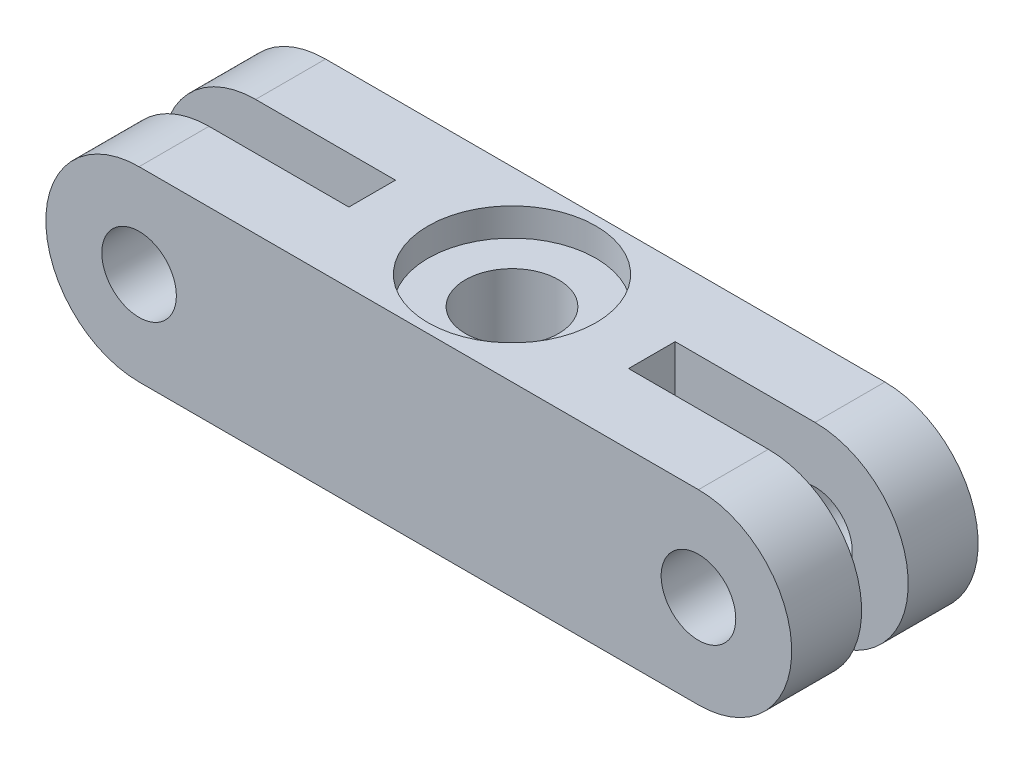
ISO-10303-21;
HEADER;
FILE_DESCRIPTION(('STEP AP214'),'2;1');
FILE_NAME('part.step','',(''),(''),'','','');
FILE_SCHEMA(('AUTOMOTIVE_DESIGN { 1 0 10303 214 1 1 1 1 }'));
ENDSEC;
DATA;
#1=APPLICATION_CONTEXT('core data for automotive mechanical design processes');
#2=APPLICATION_PROTOCOL_DEFINITION('international standard','automotive_design',2000,#1);
#3=PRODUCT_CONTEXT('',#1,'mechanical');
#4=PRODUCT('Part','Part','',(#3));
#5=PRODUCT_RELATED_PRODUCT_CATEGORY('part','',(#4));
#6=PRODUCT_DEFINITION_FORMATION('','',#4);
#7=PRODUCT_DEFINITION_CONTEXT('part definition',#1,'design');
#8=PRODUCT_DEFINITION('design','',#6,#7);
#9=PRODUCT_DEFINITION_SHAPE('','',#8);
#10=(LENGTH_UNIT() NAMED_UNIT(*) SI_UNIT(.MILLI.,.METRE.));
#11=(NAMED_UNIT(*) PLANE_ANGLE_UNIT() SI_UNIT($,.RADIAN.));
#12=(NAMED_UNIT(*) SI_UNIT($,.STERADIAN.) SOLID_ANGLE_UNIT());
#13=UNCERTAINTY_MEASURE_WITH_UNIT(LENGTH_MEASURE(1.E-05),#10,'distance_accuracy_value','');
#14=(GEOMETRIC_REPRESENTATION_CONTEXT(3) GLOBAL_UNCERTAINTY_ASSIGNED_CONTEXT((#13)) GLOBAL_UNIT_ASSIGNED_CONTEXT((#10,
#11,#12)) REPRESENTATION_CONTEXT('',''));
#15=CARTESIAN_POINT('',(0.,0.,0.));
#16=DIRECTION('',(0.,0.,1.));
#17=DIRECTION('',(1.,0.,0.));
#18=AXIS2_PLACEMENT_3D('',#15,#16,#17);
#19=CARTESIAN_POINT('',(0.,10.,10.));
#20=DIRECTION('',(0.,-1.,0.));
#21=DIRECTION('',(0.,0.,-1.));
#22=AXIS2_PLACEMENT_3D('',#19,#20,#21);
#23=PLANE('',#22);
#24=DIRECTION('',(0.,0.,-1.));
#25=VECTOR('',#24,1.);
#26=CARTESIAN_POINT('',(60.,10.,10.));
#27=LINE('',#26,#25);
#28=CARTESIAN_POINT('',(60.,10.,10.));
#29=VERTEX_POINT('',#28);
#30=CARTESIAN_POINT('',(60.,10.,2.5));
#31=VERTEX_POINT('',#30);
#32=EDGE_CURVE('E230',#29,#31,#27,.T.);
#33=ORIENTED_EDGE('',*,*,#32,.T.);
#34=DIRECTION('',(1.,0.,0.));
#35=VECTOR('',#34,1.);
#36=CARTESIAN_POINT('',(45.,10.,2.5));
#37=LINE('',#36,#35);
#38=CARTESIAN_POINT('',(45.,10.,2.5));
#39=VERTEX_POINT('',#38);
#40=EDGE_CURVE('E152',#39,#31,#37,.T.);
#41=ORIENTED_EDGE('',*,*,#40,.F.);
#42=DIRECTION('',(0.,0.,1.));
#43=VECTOR('',#42,1.);
#44=CARTESIAN_POINT('',(45.,10.,2.5));
#45=LINE('',#44,#43);
#46=CARTESIAN_POINT('',(45.,10.,-2.5));
#47=VERTEX_POINT('',#46);
#48=EDGE_CURVE('E136',#47,#39,#45,.T.);
#49=ORIENTED_EDGE('',*,*,#48,.F.);
#50=DIRECTION('',(-1.,0.,0.));
#51=VECTOR('',#50,1.);
#52=CARTESIAN_POINT('',(45.,10.,-2.5));
#53=LINE('',#52,#51);
#54=CARTESIAN_POINT('',(60.,10.,-2.5));
#55=VERTEX_POINT('',#54);
#56=EDGE_CURVE('E128',#55,#47,#53,.T.);
#57=ORIENTED_EDGE('',*,*,#56,.F.);
#58=CARTESIAN_POINT('',(60.,10.,-10.));
#59=VERTEX_POINT('',#58);
#60=EDGE_CURVE('E229',#55,#59,#27,.T.);
#61=ORIENTED_EDGE('',*,*,#60,.T.);
#62=DIRECTION('',(-1.,0.,0.));
#63=VECTOR('',#62,1.);
#64=CARTESIAN_POINT('',(0.,10.,-10.));
#65=LINE('',#64,#63);
#66=CARTESIAN_POINT('',(0.,10.,-10.));
#67=VERTEX_POINT('',#66);
#68=EDGE_CURVE('E209',#59,#67,#65,.T.);
#69=ORIENTED_EDGE('',*,*,#68,.T.);
#70=DIRECTION('',(0.,0.,-1.));
#71=VECTOR('',#70,1.);
#72=CARTESIAN_POINT('',(0.,10.,10.));
#73=LINE('',#72,#71);
#74=CARTESIAN_POINT('',(0.,10.,-2.5));
#75=VERTEX_POINT('',#74);
#76=EDGE_CURVE('E215',#75,#67,#73,.T.);
#77=ORIENTED_EDGE('',*,*,#76,.F.);
#78=DIRECTION('',(-1.,0.,0.));
#79=VECTOR('',#78,1.);
#80=CARTESIAN_POINT('',(15.,10.,-2.5));
#81=LINE('',#80,#79);
#82=CARTESIAN_POINT('',(15.,10.,-2.5));
#83=VERTEX_POINT('',#82);
#84=EDGE_CURVE('E165',#83,#75,#81,.T.);
#85=ORIENTED_EDGE('',*,*,#84,.F.);
#86=DIRECTION('',(0.,0.,-1.));
#87=VECTOR('',#86,1.);
#88=CARTESIAN_POINT('',(15.,10.,2.5));
#89=LINE('',#88,#87);
#90=CARTESIAN_POINT('',(15.,10.,2.5));
#91=VERTEX_POINT('',#90);
#92=EDGE_CURVE('E56',#91,#83,#89,.T.);
#93=ORIENTED_EDGE('',*,*,#92,.F.);
#94=DIRECTION('',(1.,0.,0.));
#95=VECTOR('',#94,1.);
#96=CARTESIAN_POINT('',(15.,10.,2.5));
#97=LINE('',#96,#95);
#98=CARTESIAN_POINT('',(0.,10.,2.5));
#99=VERTEX_POINT('',#98);
#100=EDGE_CURVE('E169',#99,#91,#97,.T.);
#101=ORIENTED_EDGE('',*,*,#100,.F.);
#102=CARTESIAN_POINT('',(0.,10.,10.));
#103=VERTEX_POINT('',#102);
#104=EDGE_CURVE('E226',#103,#99,#73,.T.);
#105=ORIENTED_EDGE('',*,*,#104,.F.);
#106=DIRECTION('',(-1.,0.,0.));
#107=VECTOR('',#106,1.);
#108=CARTESIAN_POINT('',(0.,10.,10.));
#109=LINE('',#108,#107);
#110=EDGE_CURVE('E213',#29,#103,#109,.T.);
#111=ORIENTED_EDGE('',*,*,#110,.F.);
#112=EDGE_LOOP('',(#33,#41,#49,#57,#61,#69,#77,#85,#93,#101,#105,#111));
#113=FACE_BOUND('',#112,.T.);
#114=CARTESIAN_POINT('',(30.,10.,0.));
#115=DIRECTION('',(0.,1.,0.));
#116=DIRECTION('',(0.,0.,1.));
#117=AXIS2_PLACEMENT_3D('',#114,#115,#116);
#118=CIRCLE('',#117,9.00000000000001);
#119=CARTESIAN_POINT('',(30.,10.,9.00000000000001));
#120=VERTEX_POINT('',#119);
#121=EDGE_CURVE('E358',#120,#120,#118,.T.);
#122=ORIENTED_EDGE('',*,*,#121,.F.);
#123=EDGE_LOOP('',(#122));
#124=FACE_BOUND('',#123,.T.);
#125=ADVANCED_FACE('F39',(#113,#124),#23,.F.);
#126=CARTESIAN_POINT('',(0.,0.,10.));
#127=DIRECTION('',(0.,0.,-1.));
#128=DIRECTION('',(-1.,0.,0.));
#129=AXIS2_PLACEMENT_3D('',#126,#127,#128);
#130=CYLINDRICAL_SURFACE('',#129,10.);
#131=ORIENTED_EDGE('',*,*,#104,.T.);
#132=CARTESIAN_POINT('',(0.,0.,2.5));
#133=DIRECTION('',(0.,0.,1.));
#134=DIRECTION('',(1.,0.,0.));
#135=AXIS2_PLACEMENT_3D('',#132,#133,#134);
#136=CIRCLE('',#135,10.);
#137=CARTESIAN_POINT('',(0.,-10.,2.5));
#138=VERTEX_POINT('',#137);
#139=EDGE_CURVE('E190',#99,#138,#136,.T.);
#140=ORIENTED_EDGE('',*,*,#139,.T.);
#141=DIRECTION('',(0.,0.,-1.));
#142=VECTOR('',#141,1.);
#143=CARTESIAN_POINT('',(0.,-10.,10.));
#144=LINE('',#143,#142);
#145=CARTESIAN_POINT('',(0.,-10.,10.));
#146=VERTEX_POINT('',#145);
#147=EDGE_CURVE('E11',#146,#138,#144,.T.);
#148=ORIENTED_EDGE('',*,*,#147,.F.);
#149=CARTESIAN_POINT('',(0.,0.,10.));
#150=DIRECTION('',(0.,0.,1.));
#151=DIRECTION('',(1.,0.,0.));
#152=AXIS2_PLACEMENT_3D('',#149,#150,#151);
#153=CIRCLE('',#152,10.);
#154=EDGE_CURVE('E205',#103,#146,#153,.T.);
#155=ORIENTED_EDGE('',*,*,#154,.F.);
#156=EDGE_LOOP('',(#131,#140,#148,#155));
#157=FACE_BOUND('',#156,.T.);
#158=ADVANCED_FACE('F277',(#157),#130,.T.);
#159=CARTESIAN_POINT('',(60.,0.,10.));
#160=DIRECTION('',(0.,0.,-1.));
#161=DIRECTION('',(-1.,0.,0.));
#162=AXIS2_PLACEMENT_3D('',#159,#160,#161);
#163=CYLINDRICAL_SURFACE('',#162,10.);
#164=CARTESIAN_POINT('',(60.,0.,2.5));
#165=DIRECTION('',(0.,0.,1.));
#166=DIRECTION('',(1.,0.,0.));
#167=AXIS2_PLACEMENT_3D('',#164,#165,#166);
#168=CIRCLE('',#167,10.);
#169=CARTESIAN_POINT('',(60.,-10.,2.5));
#170=VERTEX_POINT('',#169);
#171=EDGE_CURVE('E185',#170,#31,#168,.T.);
#172=ORIENTED_EDGE('',*,*,#171,.T.);
#173=ORIENTED_EDGE('',*,*,#32,.F.);
#174=CARTESIAN_POINT('',(60.,0.,10.));
#175=DIRECTION('',(0.,0.,1.));
#176=DIRECTION('',(1.,0.,0.));
#177=AXIS2_PLACEMENT_3D('',#174,#175,#176);
#178=CIRCLE('',#177,10.);
#179=CARTESIAN_POINT('',(60.,-10.,10.));
#180=VERTEX_POINT('',#179);
#181=EDGE_CURVE('E211',#180,#29,#178,.T.);
#182=ORIENTED_EDGE('',*,*,#181,.F.);
#183=DIRECTION('',(0.,0.,-1.));
#184=VECTOR('',#183,1.);
#185=CARTESIAN_POINT('',(60.,-10.,10.));
#186=LINE('',#185,#184);
#187=EDGE_CURVE('E233',#180,#170,#186,.T.);
#188=ORIENTED_EDGE('',*,*,#187,.T.);
#189=EDGE_LOOP('',(#172,#173,#182,#188));
#190=FACE_BOUND('',#189,.T.);
#191=ADVANCED_FACE('F284',(#190),#163,.T.);
#192=CARTESIAN_POINT('',(0.,0.,10.));
#193=DIRECTION('',(0.,0.,-1.));
#194=DIRECTION('',(-1.,0.,0.));
#195=AXIS2_PLACEMENT_3D('',#192,#193,#194);
#196=CYLINDRICAL_SURFACE('',#195,4.);
#197=CARTESIAN_POINT('',(0.,0.,2.5));
#198=DIRECTION('',(0.,0.,1.));
#199=DIRECTION('',(1.,0.,0.));
#200=AXIS2_PLACEMENT_3D('',#197,#198,#199);
#201=CIRCLE('',#200,4.);
#202=CARTESIAN_POINT('',(4.,0.,2.5));
#203=VERTEX_POINT('',#202);
#204=EDGE_CURVE('E43',#203,#203,#201,.T.);
#205=ORIENTED_EDGE('',*,*,#204,.F.);
#206=EDGE_LOOP('',(#205));
#207=FACE_BOUND('',#206,.T.);
#208=CARTESIAN_POINT('',(0.,0.,10.));
#209=DIRECTION('',(0.,0.,1.));
#210=DIRECTION('',(1.,0.,0.));
#211=AXIS2_PLACEMENT_3D('',#208,#209,#210);
#212=CIRCLE('',#211,4.);
#213=CARTESIAN_POINT('',(4.,0.,10.));
#214=VERTEX_POINT('',#213);
#215=EDGE_CURVE('E199',#214,#214,#212,.T.);
#216=ORIENTED_EDGE('',*,*,#215,.T.);
#217=EDGE_LOOP('',(#216));
#218=FACE_BOUND('',#217,.T.);
#219=ADVANCED_FACE('F251',(#207,#218),#196,.F.);
#220=CARTESIAN_POINT('',(60.,0.,10.));
#221=DIRECTION('',(0.,0.,-1.));
#222=DIRECTION('',(-1.,0.,0.));
#223=AXIS2_PLACEMENT_3D('',#220,#221,#222);
#224=CYLINDRICAL_SURFACE('',#223,4.00000000000001);
#225=CARTESIAN_POINT('',(60.,0.,2.5));
#226=DIRECTION('',(0.,0.,1.));
#227=DIRECTION('',(1.,0.,0.));
#228=AXIS2_PLACEMENT_3D('',#225,#226,#227);
#229=CIRCLE('',#228,4.00000000000001);
#230=CARTESIAN_POINT('',(64.,0.,2.5));
#231=VERTEX_POINT('',#230);
#232=EDGE_CURVE('E184',#231,#231,#229,.T.);
#233=ORIENTED_EDGE('',*,*,#232,.F.);
#234=EDGE_LOOP('',(#233));
#235=FACE_BOUND('',#234,.T.);
#236=CARTESIAN_POINT('',(60.,0.,10.));
#237=DIRECTION('',(0.,0.,1.));
#238=DIRECTION('',(1.,0.,0.));
#239=AXIS2_PLACEMENT_3D('',#236,#237,#238);
#240=CIRCLE('',#239,4.00000000000001);
#241=CARTESIAN_POINT('',(64.,0.,10.));
#242=VERTEX_POINT('',#241);
#243=EDGE_CURVE('E193',#242,#242,#240,.T.);
#244=ORIENTED_EDGE('',*,*,#243,.T.);
#245=EDGE_LOOP('',(#244));
#246=FACE_BOUND('',#245,.T.);
#247=ADVANCED_FACE('F266',(#235,#246),#224,.F.);
#248=CARTESIAN_POINT('',(0.,0.,10.));
#249=DIRECTION('',(0.,0.,1.));
#250=DIRECTION('',(1.,0.,0.));
#251=AXIS2_PLACEMENT_3D('',#248,#249,#250);
#252=PLANE('',#251);
#253=ORIENTED_EDGE('',*,*,#215,.F.);
#254=EDGE_LOOP('',(#253));
#255=FACE_BOUND('',#254,.T.);
#256=ORIENTED_EDGE('',*,*,#154,.T.);
#257=DIRECTION('',(1.,0.,0.));
#258=VECTOR('',#257,1.);
#259=CARTESIAN_POINT('',(0.,-10.,10.));
#260=LINE('',#259,#258);
#261=EDGE_CURVE('E208',#146,#180,#260,.T.);
#262=ORIENTED_EDGE('',*,*,#261,.T.);
#263=ORIENTED_EDGE('',*,*,#181,.T.);
#264=ORIENTED_EDGE('',*,*,#110,.T.);
#265=EDGE_LOOP('',(#256,#262,#263,#264));
#266=FACE_BOUND('',#265,.T.);
#267=ORIENTED_EDGE('',*,*,#243,.F.);
#268=EDGE_LOOP('',(#267));
#269=FACE_BOUND('',#268,.T.);
#270=ADVANCED_FACE('F257',(#255,#266,#269),#252,.T.);
#271=CARTESIAN_POINT('',(0.,0.,-10.));
#272=DIRECTION('',(0.,0.,1.));
#273=DIRECTION('',(1.,0.,0.));
#274=AXIS2_PLACEMENT_3D('',#271,#272,#273);
#275=PLANE('',#274);
#276=CARTESIAN_POINT('',(0.,0.,-10.));
#277=DIRECTION('',(0.,0.,1.));
#278=DIRECTION('',(1.,0.,0.));
#279=AXIS2_PLACEMENT_3D('',#276,#277,#278);
#280=CIRCLE('',#279,10.);
#281=CARTESIAN_POINT('',(0.,-10.,-10.));
#282=VERTEX_POINT('',#281);
#283=EDGE_CURVE('E202',#67,#282,#280,.T.);
#284=ORIENTED_EDGE('',*,*,#283,.F.);
#285=ORIENTED_EDGE('',*,*,#68,.F.);
#286=CARTESIAN_POINT('',(60.,0.,-10.));
#287=DIRECTION('',(0.,0.,1.));
#288=DIRECTION('',(1.,0.,0.));
#289=AXIS2_PLACEMENT_3D('',#286,#287,#288);
#290=CIRCLE('',#289,10.);
#291=CARTESIAN_POINT('',(60.,-10.,-10.));
#292=VERTEX_POINT('',#291);
#293=EDGE_CURVE('E221',#292,#59,#290,.T.);
#294=ORIENTED_EDGE('',*,*,#293,.F.);
#295=DIRECTION('',(1.,0.,0.));
#296=VECTOR('',#295,1.);
#297=CARTESIAN_POINT('',(0.,-10.,-10.));
#298=LINE('',#297,#296);
#299=EDGE_CURVE('E218',#282,#292,#298,.T.);
#300=ORIENTED_EDGE('',*,*,#299,.F.);
#301=EDGE_LOOP('',(#284,#285,#294,#300));
#302=FACE_BOUND('',#301,.T.);
#303=CARTESIAN_POINT('',(0.,0.,-10.));
#304=DIRECTION('',(0.,0.,1.));
#305=DIRECTION('',(1.,0.,0.));
#306=AXIS2_PLACEMENT_3D('',#303,#304,#305);
#307=CIRCLE('',#306,4.);
#308=CARTESIAN_POINT('',(4.,0.,-10.));
#309=VERTEX_POINT('',#308);
#310=EDGE_CURVE('E196',#309,#309,#307,.T.);
#311=ORIENTED_EDGE('',*,*,#310,.T.);
#312=EDGE_LOOP('',(#311));
#313=FACE_BOUND('',#312,.T.);
#314=CARTESIAN_POINT('',(60.,0.,-10.));
#315=DIRECTION('',(0.,0.,1.));
#316=DIRECTION('',(1.,0.,0.));
#317=AXIS2_PLACEMENT_3D('',#314,#315,#316);
#318=CIRCLE('',#317,4.00000000000001);
#319=CARTESIAN_POINT('',(64.,0.,-10.));
#320=VERTEX_POINT('',#319);
#321=EDGE_CURVE('E192',#320,#320,#318,.T.);
#322=ORIENTED_EDGE('',*,*,#321,.T.);
#323=EDGE_LOOP('',(#322));
#324=FACE_BOUND('',#323,.T.);
#325=ADVANCED_FACE('F254',(#302,#313,#324),#275,.F.);
#326=CARTESIAN_POINT('',(0.,0.,-2.5));
#327=DIRECTION('',(0.,0.,-1.));
#328=DIRECTION('',(-1.,0.,0.));
#329=AXIS2_PLACEMENT_3D('',#326,#327,#328);
#330=CIRCLE('',#329,10.);
#331=CARTESIAN_POINT('',(0.,-10.,-2.5));
#332=VERTEX_POINT('',#331);
#333=EDGE_CURVE('E188',#332,#75,#330,.T.);
#334=ORIENTED_EDGE('',*,*,#333,.T.);
#335=ORIENTED_EDGE('',*,*,#76,.T.);
#336=ORIENTED_EDGE('',*,*,#283,.T.);
#337=EDGE_CURVE('E48',#332,#282,#144,.T.);
#338=ORIENTED_EDGE('',*,*,#337,.F.);
#339=EDGE_LOOP('',(#334,#335,#336,#338));
#340=FACE_BOUND('',#339,.T.);
#341=ADVANCED_FACE('F41',(#340),#130,.T.);
#342=CARTESIAN_POINT('',(0.,-10.,10.));
#343=DIRECTION('',(0.,1.,0.));
#344=DIRECTION('',(0.,0.,1.));
#345=AXIS2_PLACEMENT_3D('',#342,#343,#344);
#346=PLANE('',#345);
#347=CARTESIAN_POINT('',(30.,-10.,0.));
#348=DIRECTION('',(0.,1.,0.));
#349=DIRECTION('',(0.,0.,1.));
#350=AXIS2_PLACEMENT_3D('',#347,#348,#349);
#351=CIRCLE('',#350,5.00000000000001);
#352=CARTESIAN_POINT('',(30.,-10.,5.00000000000001));
#353=VERTEX_POINT('',#352);
#354=EDGE_CURVE('E166',#353,#353,#351,.T.);
#355=ORIENTED_EDGE('',*,*,#354,.T.);
#356=EDGE_LOOP('',(#355));
#357=FACE_BOUND('',#356,.T.);
#358=DIRECTION('',(0.,0.,1.));
#359=VECTOR('',#358,1.);
#360=CARTESIAN_POINT('',(45.,-10.,2.5));
#361=LINE('',#360,#359);
#362=CARTESIAN_POINT('',(45.,-10.,-2.5));
#363=VERTEX_POINT('',#362);
#364=CARTESIAN_POINT('',(45.,-10.,2.5));
#365=VERTEX_POINT('',#364);
#366=EDGE_CURVE('E144',#363,#365,#361,.T.);
#367=ORIENTED_EDGE('',*,*,#366,.T.);
#368=DIRECTION('',(1.,0.,0.));
#369=VECTOR('',#368,1.);
#370=CARTESIAN_POINT('',(45.,-10.,2.5));
#371=LINE('',#370,#369);
#372=EDGE_CURVE('E147',#365,#170,#371,.T.);
#373=ORIENTED_EDGE('',*,*,#372,.T.);
#374=ORIENTED_EDGE('',*,*,#187,.F.);
#375=ORIENTED_EDGE('',*,*,#261,.F.);
#376=ORIENTED_EDGE('',*,*,#147,.T.);
#377=DIRECTION('',(1.,0.,0.));
#378=VECTOR('',#377,1.);
#379=CARTESIAN_POINT('',(15.,-10.,2.5));
#380=LINE('',#379,#378);
#381=CARTESIAN_POINT('',(15.,-10.,2.5));
#382=VERTEX_POINT('',#381);
#383=EDGE_CURVE('E177',#138,#382,#380,.T.);
#384=ORIENTED_EDGE('',*,*,#383,.T.);
#385=DIRECTION('',(0.,0.,-1.));
#386=VECTOR('',#385,1.);
#387=CARTESIAN_POINT('',(15.,-10.,2.5));
#388=LINE('',#387,#386);
#389=CARTESIAN_POINT('',(15.,-10.,-2.5));
#390=VERTEX_POINT('',#389);
#391=EDGE_CURVE('E171',#382,#390,#388,.T.);
#392=ORIENTED_EDGE('',*,*,#391,.T.);
#393=DIRECTION('',(-1.,0.,0.));
#394=VECTOR('',#393,1.);
#395=CARTESIAN_POINT('',(15.,-10.,-2.5));
#396=LINE('',#395,#394);
#397=EDGE_CURVE('E174',#390,#332,#396,.T.);
#398=ORIENTED_EDGE('',*,*,#397,.T.);
#399=ORIENTED_EDGE('',*,*,#337,.T.);
#400=ORIENTED_EDGE('',*,*,#299,.T.);
#401=CARTESIAN_POINT('',(60.,-10.,-2.5));
#402=VERTEX_POINT('',#401);
#403=EDGE_CURVE('E232',#402,#292,#186,.T.);
#404=ORIENTED_EDGE('',*,*,#403,.F.);
#405=DIRECTION('',(-1.,0.,0.));
#406=VECTOR('',#405,1.);
#407=CARTESIAN_POINT('',(45.,-10.,-2.5));
#408=LINE('',#407,#406);
#409=EDGE_CURVE('E154',#402,#363,#408,.T.);
#410=ORIENTED_EDGE('',*,*,#409,.T.);
#411=EDGE_LOOP('',(#367,#373,#374,#375,#376,#384,#392,#398,#399,#400,#404,#410));
#412=FACE_BOUND('',#411,.T.);
#413=ADVANCED_FACE('F289',(#357,#412),#346,.F.);
#414=ORIENTED_EDGE('',*,*,#60,.F.);
#415=CARTESIAN_POINT('',(60.,0.,-2.5));
#416=DIRECTION('',(0.,0.,-1.));
#417=DIRECTION('',(-1.,0.,0.));
#418=AXIS2_PLACEMENT_3D('',#415,#416,#417);
#419=CIRCLE('',#418,10.);
#420=EDGE_CURVE('E64',#55,#402,#419,.T.);
#421=ORIENTED_EDGE('',*,*,#420,.T.);
#422=ORIENTED_EDGE('',*,*,#403,.T.);
#423=ORIENTED_EDGE('',*,*,#293,.T.);
#424=EDGE_LOOP('',(#414,#421,#422,#423));
#425=FACE_BOUND('',#424,.T.);
#426=ADVANCED_FACE('F249',(#425),#163,.T.);
#427=CARTESIAN_POINT('',(0.,0.,-2.5));
#428=DIRECTION('',(0.,0.,-1.));
#429=DIRECTION('',(-1.,0.,0.));
#430=AXIS2_PLACEMENT_3D('',#427,#428,#429);
#431=CIRCLE('',#430,4.);
#432=CARTESIAN_POINT('',(-4.,0.,-2.5));
#433=VERTEX_POINT('',#432);
#434=EDGE_CURVE('E187',#433,#433,#431,.T.);
#435=ORIENTED_EDGE('',*,*,#434,.F.);
#436=EDGE_LOOP('',(#435));
#437=FACE_BOUND('',#436,.T.);
#438=ORIENTED_EDGE('',*,*,#310,.F.);
#439=EDGE_LOOP('',(#438));
#440=FACE_BOUND('',#439,.T.);
#441=ADVANCED_FACE('F245',(#437,#440),#196,.F.);
#442=CARTESIAN_POINT('',(60.,0.,-2.5));
#443=DIRECTION('',(0.,0.,-1.));
#444=DIRECTION('',(-1.,0.,0.));
#445=AXIS2_PLACEMENT_3D('',#442,#443,#444);
#446=CIRCLE('',#445,4.00000000000001);
#447=CARTESIAN_POINT('',(56.,0.,-2.5));
#448=VERTEX_POINT('',#447);
#449=EDGE_CURVE('E162',#448,#448,#446,.T.);
#450=ORIENTED_EDGE('',*,*,#449,.F.);
#451=EDGE_LOOP('',(#450));
#452=FACE_BOUND('',#451,.T.);
#453=ORIENTED_EDGE('',*,*,#321,.F.);
#454=EDGE_LOOP('',(#453));
#455=FACE_BOUND('',#454,.T.);
#456=ADVANCED_FACE('F248',(#452,#455),#224,.F.);
#457=CARTESIAN_POINT('',(45.,-10.,2.5));
#458=DIRECTION('',(0.,0.,1.));
#459=DIRECTION('',(1.,0.,0.));
#460=AXIS2_PLACEMENT_3D('',#457,#458,#459);
#461=PLANE('',#460);
#462=ORIENTED_EDGE('',*,*,#232,.T.);
#463=EDGE_LOOP('',(#462));
#464=FACE_BOUND('',#463,.T.);
#465=ORIENTED_EDGE('',*,*,#171,.F.);
#466=ORIENTED_EDGE('',*,*,#372,.F.);
#467=DIRECTION('',(0.,1.,0.));
#468=VECTOR('',#467,1.);
#469=CARTESIAN_POINT('',(45.,-10.,2.5));
#470=LINE('',#469,#468);
#471=EDGE_CURVE('E146',#365,#39,#470,.T.);
#472=ORIENTED_EDGE('',*,*,#471,.T.);
#473=ORIENTED_EDGE('',*,*,#40,.T.);
#474=EDGE_LOOP('',(#465,#466,#472,#473));
#475=FACE_BOUND('',#474,.T.);
#476=ADVANCED_FACE('F263',(#464,#475),#461,.F.);
#477=CARTESIAN_POINT('',(45.,-10.,-2.5));
#478=DIRECTION('',(0.,0.,-1.));
#479=DIRECTION('',(-1.,0.,0.));
#480=AXIS2_PLACEMENT_3D('',#477,#478,#479);
#481=PLANE('',#480);
#482=ORIENTED_EDGE('',*,*,#449,.T.);
#483=EDGE_LOOP('',(#482));
#484=FACE_BOUND('',#483,.T.);
#485=ORIENTED_EDGE('',*,*,#56,.T.);
#486=DIRECTION('',(0.,1.,0.));
#487=VECTOR('',#486,1.);
#488=CARTESIAN_POINT('',(45.,-10.,-2.5));
#489=LINE('',#488,#487);
#490=EDGE_CURVE('E131',#363,#47,#489,.T.);
#491=ORIENTED_EDGE('',*,*,#490,.F.);
#492=ORIENTED_EDGE('',*,*,#409,.F.);
#493=ORIENTED_EDGE('',*,*,#420,.F.);
#494=EDGE_LOOP('',(#485,#491,#492,#493));
#495=FACE_BOUND('',#494,.T.);
#496=ADVANCED_FACE('F130',(#484,#495),#481,.F.);
#497=CARTESIAN_POINT('',(45.,-10.,2.5));
#498=DIRECTION('',(-1.,0.,0.));
#499=DIRECTION('',(0.,0.,1.));
#500=AXIS2_PLACEMENT_3D('',#497,#498,#499);
#501=PLANE('',#500);
#502=ORIENTED_EDGE('',*,*,#471,.F.);
#503=ORIENTED_EDGE('',*,*,#366,.F.);
#504=ORIENTED_EDGE('',*,*,#490,.T.);
#505=ORIENTED_EDGE('',*,*,#48,.T.);
#506=EDGE_LOOP('',(#502,#503,#504,#505));
#507=FACE_BOUND('',#506,.T.);
#508=ADVANCED_FACE('F141',(#507),#501,.F.);
#509=CARTESIAN_POINT('',(15.,-10.,2.5));
#510=DIRECTION('',(0.,0.,1.));
#511=DIRECTION('',(1.,0.,0.));
#512=AXIS2_PLACEMENT_3D('',#509,#510,#511);
#513=PLANE('',#512);
#514=ORIENTED_EDGE('',*,*,#204,.T.);
#515=EDGE_LOOP('',(#514));
#516=FACE_BOUND('',#515,.T.);
#517=ORIENTED_EDGE('',*,*,#100,.T.);
#518=DIRECTION('',(0.,1.,0.));
#519=VECTOR('',#518,1.);
#520=CARTESIAN_POINT('',(15.,-10.,2.5));
#521=LINE('',#520,#519);
#522=EDGE_CURVE('E137',#382,#91,#521,.T.);
#523=ORIENTED_EDGE('',*,*,#522,.F.);
#524=ORIENTED_EDGE('',*,*,#383,.F.);
#525=ORIENTED_EDGE('',*,*,#139,.F.);
#526=EDGE_LOOP('',(#517,#523,#524,#525));
#527=FACE_BOUND('',#526,.T.);
#528=ADVANCED_FACE('F325',(#516,#527),#513,.F.);
#529=CARTESIAN_POINT('',(15.,-10.,-2.5));
#530=DIRECTION('',(0.,0.,-1.));
#531=DIRECTION('',(-1.,0.,0.));
#532=AXIS2_PLACEMENT_3D('',#529,#530,#531);
#533=PLANE('',#532);
#534=ORIENTED_EDGE('',*,*,#434,.T.);
#535=EDGE_LOOP('',(#534));
#536=FACE_BOUND('',#535,.T.);
#537=ORIENTED_EDGE('',*,*,#333,.F.);
#538=ORIENTED_EDGE('',*,*,#397,.F.);
#539=DIRECTION('',(0.,1.,0.));
#540=VECTOR('',#539,1.);
#541=CARTESIAN_POINT('',(15.,-10.,-2.5));
#542=LINE('',#541,#540);
#543=EDGE_CURVE('E180',#390,#83,#542,.T.);
#544=ORIENTED_EDGE('',*,*,#543,.T.);
#545=ORIENTED_EDGE('',*,*,#84,.T.);
#546=EDGE_LOOP('',(#537,#538,#544,#545));
#547=FACE_BOUND('',#546,.T.);
#548=ADVANCED_FACE('F242',(#536,#547),#533,.F.);
#549=CARTESIAN_POINT('',(15.,-10.,2.5));
#550=DIRECTION('',(1.,0.,0.));
#551=DIRECTION('',(0.,0.,-1.));
#552=AXIS2_PLACEMENT_3D('',#549,#550,#551);
#553=PLANE('',#552);
#554=ORIENTED_EDGE('',*,*,#543,.F.);
#555=ORIENTED_EDGE('',*,*,#391,.F.);
#556=ORIENTED_EDGE('',*,*,#522,.T.);
#557=ORIENTED_EDGE('',*,*,#92,.T.);
#558=EDGE_LOOP('',(#554,#555,#556,#557));
#559=FACE_BOUND('',#558,.T.);
#560=ADVANCED_FACE('F326',(#559),#553,.F.);
#561=CARTESIAN_POINT('',(30.,10.,0.));
#562=DIRECTION('',(0.,1.,0.));
#563=DIRECTION('',(0.,0.,1.));
#564=AXIS2_PLACEMENT_3D('',#561,#562,#563);
#565=CYLINDRICAL_SURFACE('',#564,5.00000000000001);
#566=ORIENTED_EDGE('',*,*,#354,.F.);
#567=EDGE_LOOP('',(#566));
#568=FACE_BOUND('',#567,.T.);
#569=CARTESIAN_POINT('',(30.,7.,0.));
#570=DIRECTION('',(0.,1.,0.));
#571=DIRECTION('',(0.,0.,1.));
#572=AXIS2_PLACEMENT_3D('',#569,#570,#571);
#573=CIRCLE('',#572,5.00000000000001);
#574=CARTESIAN_POINT('',(30.,7.,5.00000000000001));
#575=VERTEX_POINT('',#574);
#576=EDGE_CURVE('E360',#575,#575,#573,.T.);
#577=ORIENTED_EDGE('',*,*,#576,.T.);
#578=EDGE_LOOP('',(#577));
#579=FACE_BOUND('',#578,.T.);
#580=ADVANCED_FACE('F327',(#568,#579),#565,.F.);
#581=CARTESIAN_POINT('',(35.,7.,0.));
#582=DIRECTION('',(0.,-1.,0.));
#583=DIRECTION('',(0.,0.,-1.));
#584=AXIS2_PLACEMENT_3D('',#581,#582,#583);
#585=PLANE('',#584);
#586=ORIENTED_EDGE('',*,*,#576,.F.);
#587=EDGE_LOOP('',(#586));
#588=FACE_BOUND('',#587,.T.);
#589=CARTESIAN_POINT('',(30.,7.,0.));
#590=DIRECTION('',(0.,1.,0.));
#591=DIRECTION('',(0.,0.,1.));
#592=AXIS2_PLACEMENT_3D('',#589,#590,#591);
#593=CIRCLE('',#592,9.00000000000001);
#594=CARTESIAN_POINT('',(30.,7.,9.00000000000001));
#595=VERTEX_POINT('',#594);
#596=EDGE_CURVE('E355',#595,#595,#593,.T.);
#597=ORIENTED_EDGE('',*,*,#596,.T.);
#598=EDGE_LOOP('',(#597));
#599=FACE_BOUND('',#598,.T.);
#600=ADVANCED_FACE('F331',(#588,#599),#585,.F.);
#601=CARTESIAN_POINT('',(30.,10.,0.));
#602=DIRECTION('',(0.,1.,0.));
#603=DIRECTION('',(0.,0.,1.));
#604=AXIS2_PLACEMENT_3D('',#601,#602,#603);
#605=CYLINDRICAL_SURFACE('',#604,9.00000000000001);
#606=ORIENTED_EDGE('',*,*,#596,.F.);
#607=EDGE_LOOP('',(#606));
#608=FACE_BOUND('',#607,.T.);
#609=ORIENTED_EDGE('',*,*,#121,.T.);
#610=EDGE_LOOP('',(#609));
#611=FACE_BOUND('',#610,.T.);
#612=ADVANCED_FACE('F346',(#608,#611),#605,.F.);
#613=CLOSED_SHELL('',(#125,#158,#191,#219,#247,#270,#325,#341,#413,#426,#441,#456,#476,#496,
#508,#528,#548,#560,#580,#600,#612));
#614=MANIFOLD_SOLID_BREP('B2',#613);
#615=ADVANCED_BREP_SHAPE_REPRESENTATION('',(#18,#614),#14);
#616=SHAPE_DEFINITION_REPRESENTATION(#9,#615);
ENDSEC;
END-ISO-10303-21;
